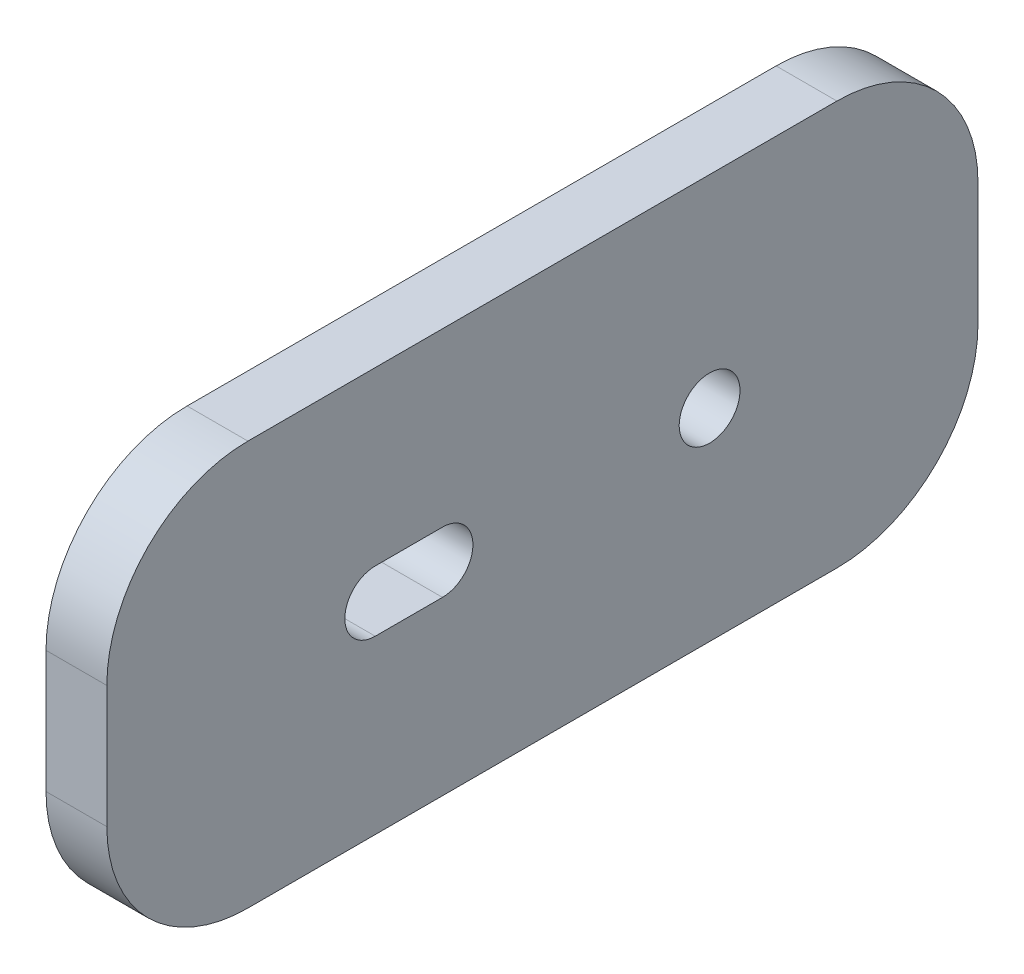
ISO-10303-21;
HEADER;
FILE_DESCRIPTION(('STEP AP214'),'2;1');
FILE_NAME('part.step','',(''),(''),'','','');
FILE_SCHEMA(('AUTOMOTIVE_DESIGN { 1 0 10303 214 1 1 1 1 }'));
ENDSEC;
DATA;
#1=APPLICATION_CONTEXT('core data for automotive mechanical design processes');
#2=APPLICATION_PROTOCOL_DEFINITION('international standard','automotive_design',2000,#1);
#3=PRODUCT_CONTEXT('',#1,'mechanical');
#4=PRODUCT('Part','Part','',(#3));
#5=PRODUCT_RELATED_PRODUCT_CATEGORY('part','',(#4));
#6=PRODUCT_DEFINITION_FORMATION('','',#4);
#7=PRODUCT_DEFINITION_CONTEXT('part definition',#1,'design');
#8=PRODUCT_DEFINITION('design','',#6,#7);
#9=PRODUCT_DEFINITION_SHAPE('','',#8);
#10=(LENGTH_UNIT() NAMED_UNIT(*) SI_UNIT(.MILLI.,.METRE.));
#11=(NAMED_UNIT(*) PLANE_ANGLE_UNIT() SI_UNIT($,.RADIAN.));
#12=(NAMED_UNIT(*) SI_UNIT($,.STERADIAN.) SOLID_ANGLE_UNIT());
#13=UNCERTAINTY_MEASURE_WITH_UNIT(LENGTH_MEASURE(1.E-05),#10,'distance_accuracy_value','');
#14=(GEOMETRIC_REPRESENTATION_CONTEXT(3) GLOBAL_UNCERTAINTY_ASSIGNED_CONTEXT((#13)) GLOBAL_UNIT_ASSIGNED_CONTEXT((#10,
#11,#12)) REPRESENTATION_CONTEXT('',''));
#15=CARTESIAN_POINT('',(0.,0.,0.));
#16=DIRECTION('',(0.,0.,1.));
#17=DIRECTION('',(1.,0.,0.));
#18=AXIS2_PLACEMENT_3D('',#15,#16,#17);
#19=CARTESIAN_POINT('',(0.,0.,0.));
#20=DIRECTION('',(1.,0.,0.));
#21=DIRECTION('',(0.,0.,-1.));
#22=AXIS2_PLACEMENT_3D('',#19,#20,#21);
#23=PLANE('',#22);
#24=CARTESIAN_POINT('',(0.,-6.38154088395931,-30.7417133345017));
#25=DIRECTION('',(-1.,0.,0.));
#26=DIRECTION('',(0.,0.,1.));
#27=AXIS2_PLACEMENT_3D('',#24,#25,#26);
#28=CIRCLE('',#27,14.7267027304759);
#29=CARTESIAN_POINT('',(0.,-21.1082436144352,-30.7417133345017));
#30=VERTEX_POINT('',#29);
#31=CARTESIAN_POINT('',(0.,-6.38154088395931,-45.4684160649777));
#32=VERTEX_POINT('',#31);
#33=EDGE_CURVE('E142',#30,#32,#28,.F.);
#34=ORIENTED_EDGE('',*,*,#33,.F.);
#35=DIRECTION('',(0.,0.,1.));
#36=VECTOR('',#35,1.);
#37=CARTESIAN_POINT('',(0.,-21.1082436144352,0.));
#38=LINE('',#37,#36);
#39=CARTESIAN_POINT('',(0.,-21.1082436144352,30.7417133345017));
#40=VERTEX_POINT('',#39);
#41=EDGE_CURVE('E128',#30,#40,#38,.T.);
#42=ORIENTED_EDGE('',*,*,#41,.T.);
#43=CARTESIAN_POINT('',(0.,-6.38154088395931,30.7417133345017));
#44=DIRECTION('',(1.,0.,0.));
#45=DIRECTION('',(0.,0.,-1.));
#46=AXIS2_PLACEMENT_3D('',#43,#44,#45);
#47=CIRCLE('',#46,14.7267027304759);
#48=CARTESIAN_POINT('',(0.,-6.38154088395931,45.4684160649777));
#49=VERTEX_POINT('',#48);
#50=EDGE_CURVE('E169',#49,#40,#47,.T.);
#51=ORIENTED_EDGE('',*,*,#50,.F.);
#52=DIRECTION('',(0.,1.,0.));
#53=VECTOR('',#52,1.);
#54=CARTESIAN_POINT('',(0.,0.,45.4684160649777));
#55=LINE('',#54,#53);
#56=CARTESIAN_POINT('',(0.,6.38154088395931,45.4684160649777));
#57=VERTEX_POINT('',#56);
#58=EDGE_CURVE('E132',#57,#49,#55,.F.);
#59=ORIENTED_EDGE('',*,*,#58,.F.);
#60=CARTESIAN_POINT('',(0.,6.38154088395931,30.7417133345017));
#61=DIRECTION('',(-1.,0.,0.));
#62=DIRECTION('',(0.,0.,1.));
#63=AXIS2_PLACEMENT_3D('',#60,#61,#62);
#64=CIRCLE('',#63,14.7267027304759);
#65=CARTESIAN_POINT('',(0.,21.1082436144352,30.7417133345017));
#66=VERTEX_POINT('',#65);
#67=EDGE_CURVE('E135',#66,#57,#64,.F.);
#68=ORIENTED_EDGE('',*,*,#67,.F.);
#69=DIRECTION('',(0.,0.,1.));
#70=VECTOR('',#69,1.);
#71=CARTESIAN_POINT('',(0.,21.1082436144352,0.));
#72=LINE('',#71,#70);
#73=CARTESIAN_POINT('',(0.,21.1082436144352,-30.7417133345017));
#74=VERTEX_POINT('',#73);
#75=EDGE_CURVE('E136',#74,#66,#72,.T.);
#76=ORIENTED_EDGE('',*,*,#75,.F.);
#77=CARTESIAN_POINT('',(0.,6.38154088395931,-30.7417133345017));
#78=DIRECTION('',(1.,0.,0.));
#79=DIRECTION('',(0.,0.,-1.));
#80=AXIS2_PLACEMENT_3D('',#77,#78,#79);
#81=CIRCLE('',#80,14.7267027304759);
#82=CARTESIAN_POINT('',(0.,6.38154088395931,-45.4684160649777));
#83=VERTEX_POINT('',#82);
#84=EDGE_CURVE('E175',#83,#74,#81,.T.);
#85=ORIENTED_EDGE('',*,*,#84,.F.);
#86=DIRECTION('',(0.,1.,0.));
#87=VECTOR('',#86,1.);
#88=CARTESIAN_POINT('',(0.,0.,-45.4684160649777));
#89=LINE('',#88,#87);
#90=EDGE_CURVE('E140',#83,#32,#89,.F.);
#91=ORIENTED_EDGE('',*,*,#90,.T.);
#92=EDGE_LOOP('',(#34,#42,#51,#59,#68,#76,#85,#91));
#93=FACE_BOUND('',#92,.T.);
#94=CARTESIAN_POINT('',(0.,0.,-17.45));
#95=DIRECTION('',(-1.,0.,0.));
#96=DIRECTION('',(0.,0.,1.));
#97=AXIS2_PLACEMENT_3D('',#94,#95,#96);
#98=CIRCLE('',#97,3.175);
#99=CARTESIAN_POINT('',(0.,0.,-14.275));
#100=VERTEX_POINT('',#99);
#101=EDGE_CURVE('E131',#100,#100,#98,.F.);
#102=ORIENTED_EDGE('',*,*,#101,.T.);
#103=EDGE_LOOP('',(#102));
#104=FACE_BOUND('',#103,.T.);
#105=CARTESIAN_POINT('',(0.,0.,10.4300102));
#106=DIRECTION('',(-1.,0.,0.));
#107=DIRECTION('',(0.,0.,1.));
#108=AXIS2_PLACEMENT_3D('',#105,#106,#107);
#109=CIRCLE('',#108,3.175);
#110=CARTESIAN_POINT('',(0.,-3.175,10.4300102));
#111=VERTEX_POINT('',#110);
#112=CARTESIAN_POINT('',(0.,3.175,10.4300102));
#113=VERTEX_POINT('',#112);
#114=EDGE_CURVE('E182',#111,#113,#109,.F.);
#115=ORIENTED_EDGE('',*,*,#114,.T.);
#116=DIRECTION('',(0.,0.,1.));
#117=VECTOR('',#116,1.);
#118=CARTESIAN_POINT('',(0.,3.175,13.9400051));
#119=LINE('',#118,#117);
#120=CARTESIAN_POINT('',(0.,3.175,17.45));
#121=VERTEX_POINT('',#120);
#122=EDGE_CURVE('E117',#113,#121,#119,.T.);
#123=ORIENTED_EDGE('',*,*,#122,.T.);
#124=CARTESIAN_POINT('',(0.,0.,17.45));
#125=DIRECTION('',(-1.,0.,0.));
#126=DIRECTION('',(0.,0.,1.));
#127=AXIS2_PLACEMENT_3D('',#124,#125,#126);
#128=CIRCLE('',#127,3.175);
#129=CARTESIAN_POINT('',(0.,-3.175,17.45));
#130=VERTEX_POINT('',#129);
#131=EDGE_CURVE('E20',#121,#130,#128,.F.);
#132=ORIENTED_EDGE('',*,*,#131,.T.);
#133=DIRECTION('',(0.,0.,1.));
#134=VECTOR('',#133,1.);
#135=CARTESIAN_POINT('',(0.,-3.175,13.9400051));
#136=LINE('',#135,#134);
#137=EDGE_CURVE('E107',#111,#130,#136,.T.);
#138=ORIENTED_EDGE('',*,*,#137,.F.);
#139=EDGE_LOOP('',(#115,#123,#132,#138));
#140=FACE_BOUND('',#139,.T.);
#141=ADVANCED_FACE('F17',(#93,#104,#140),#23,.F.);
#142=CARTESIAN_POINT('',(6.35,-3.175,13.9400051));
#143=DIRECTION('',(0.,1.,0.));
#144=DIRECTION('',(0.,0.,1.));
#145=AXIS2_PLACEMENT_3D('',#142,#143,#144);
#146=PLANE('',#145);
#147=DIRECTION('',(0.,0.,-1.));
#148=VECTOR('',#147,1.);
#149=CARTESIAN_POINT('',(6.35,-3.175,0.));
#150=LINE('',#149,#148);
#151=CARTESIAN_POINT('',(6.35,-3.175,10.4300102));
#152=VERTEX_POINT('',#151);
#153=CARTESIAN_POINT('',(6.35,-3.175,17.45));
#154=VERTEX_POINT('',#153);
#155=EDGE_CURVE('E168',#152,#154,#150,.F.);
#156=ORIENTED_EDGE('',*,*,#155,.F.);
#157=DIRECTION('',(-1.,0.,0.));
#158=VECTOR('',#157,1.);
#159=CARTESIAN_POINT('',(6.35,-3.175,10.4300102));
#160=LINE('',#159,#158);
#161=EDGE_CURVE('E112',#152,#111,#160,.T.);
#162=ORIENTED_EDGE('',*,*,#161,.T.);
#163=ORIENTED_EDGE('',*,*,#137,.T.);
#164=DIRECTION('',(-1.,0.,0.));
#165=VECTOR('',#164,1.);
#166=CARTESIAN_POINT('',(6.35,-3.175,17.45));
#167=LINE('',#166,#165);
#168=EDGE_CURVE('E109',#130,#154,#167,.F.);
#169=ORIENTED_EDGE('',*,*,#168,.T.);
#170=EDGE_LOOP('',(#156,#162,#163,#169));
#171=FACE_BOUND('',#170,.T.);
#172=ADVANCED_FACE('F108',(#171),#146,.T.);
#173=CARTESIAN_POINT('',(6.35,0.,17.45));
#174=DIRECTION('',(-1.,0.,0.));
#175=DIRECTION('',(0.,0.,1.));
#176=AXIS2_PLACEMENT_3D('',#173,#174,#175);
#177=CYLINDRICAL_SURFACE('',#176,3.175);
#178=DIRECTION('',(1.,0.,0.));
#179=VECTOR('',#178,1.);
#180=CARTESIAN_POINT('',(6.35,3.175,17.45));
#181=LINE('',#180,#179);
#182=CARTESIAN_POINT('',(6.35,3.175,17.45));
#183=VERTEX_POINT('',#182);
#184=EDGE_CURVE('E119',#121,#183,#181,.T.);
#185=ORIENTED_EDGE('',*,*,#184,.T.);
#186=CARTESIAN_POINT('',(6.35,0.,17.45));
#187=DIRECTION('',(-1.,0.,0.));
#188=DIRECTION('',(0.,0.,1.));
#189=AXIS2_PLACEMENT_3D('',#186,#187,#188);
#190=CIRCLE('',#189,3.175);
#191=EDGE_CURVE('E122',#154,#183,#190,.T.);
#192=ORIENTED_EDGE('',*,*,#191,.F.);
#193=ORIENTED_EDGE('',*,*,#168,.F.);
#194=ORIENTED_EDGE('',*,*,#131,.F.);
#195=EDGE_LOOP('',(#185,#192,#193,#194));
#196=FACE_BOUND('',#195,.T.);
#197=ADVANCED_FACE('F120',(#196),#177,.F.);
#198=CARTESIAN_POINT('',(6.35,3.175,13.9400051));
#199=DIRECTION('',(0.,1.,0.));
#200=DIRECTION('',(0.,0.,1.));
#201=AXIS2_PLACEMENT_3D('',#198,#199,#200);
#202=PLANE('',#201);
#203=DIRECTION('',(-1.,0.,0.));
#204=VECTOR('',#203,1.);
#205=CARTESIAN_POINT('',(6.35,3.175,10.4300102));
#206=LINE('',#205,#204);
#207=CARTESIAN_POINT('',(6.35,3.175,10.4300102));
#208=VERTEX_POINT('',#207);
#209=EDGE_CURVE('E144',#113,#208,#206,.F.);
#210=ORIENTED_EDGE('',*,*,#209,.T.);
#211=DIRECTION('',(0.,0.,-1.));
#212=VECTOR('',#211,1.);
#213=CARTESIAN_POINT('',(6.35,3.175,0.));
#214=LINE('',#213,#212);
#215=EDGE_CURVE('E166',#183,#208,#214,.T.);
#216=ORIENTED_EDGE('',*,*,#215,.F.);
#217=ORIENTED_EDGE('',*,*,#184,.F.);
#218=ORIENTED_EDGE('',*,*,#122,.F.);
#219=EDGE_LOOP('',(#210,#216,#217,#218));
#220=FACE_BOUND('',#219,.T.);
#221=ADVANCED_FACE('F335',(#220),#202,.F.);
#222=CARTESIAN_POINT('',(6.35,0.,10.4300102));
#223=DIRECTION('',(-1.,0.,0.));
#224=DIRECTION('',(0.,0.,1.));
#225=AXIS2_PLACEMENT_3D('',#222,#223,#224);
#226=CYLINDRICAL_SURFACE('',#225,3.175);
#227=ORIENTED_EDGE('',*,*,#161,.F.);
#228=CARTESIAN_POINT('',(6.35,0.,10.4300102));
#229=DIRECTION('',(-1.,0.,0.));
#230=DIRECTION('',(0.,0.,1.));
#231=AXIS2_PLACEMENT_3D('',#228,#229,#230);
#232=CIRCLE('',#231,3.175);
#233=EDGE_CURVE('E161',#208,#152,#232,.T.);
#234=ORIENTED_EDGE('',*,*,#233,.F.);
#235=ORIENTED_EDGE('',*,*,#209,.F.);
#236=ORIENTED_EDGE('',*,*,#114,.F.);
#237=EDGE_LOOP('',(#227,#234,#235,#236));
#238=FACE_BOUND('',#237,.T.);
#239=ADVANCED_FACE('F326',(#238),#226,.F.);
#240=CARTESIAN_POINT('',(6.35,0.,-17.45));
#241=DIRECTION('',(-1.,0.,0.));
#242=DIRECTION('',(0.,0.,1.));
#243=AXIS2_PLACEMENT_3D('',#240,#241,#242);
#244=CYLINDRICAL_SURFACE('',#243,3.175);
#245=ORIENTED_EDGE('',*,*,#101,.F.);
#246=EDGE_LOOP('',(#245));
#247=FACE_BOUND('',#246,.T.);
#248=CARTESIAN_POINT('',(6.35,0.,-17.45));
#249=DIRECTION('',(-1.,0.,0.));
#250=DIRECTION('',(0.,0.,1.));
#251=AXIS2_PLACEMENT_3D('',#248,#249,#250);
#252=CIRCLE('',#251,3.175);
#253=CARTESIAN_POINT('',(6.35,0.,-14.275));
#254=VERTEX_POINT('',#253);
#255=EDGE_CURVE('E158',#254,#254,#252,.T.);
#256=ORIENTED_EDGE('',*,*,#255,.F.);
#257=EDGE_LOOP('',(#256));
#258=FACE_BOUND('',#257,.T.);
#259=ADVANCED_FACE('F318',(#247,#258),#244,.F.);
#260=CARTESIAN_POINT('',(6.35,-21.1082436144352,0.));
#261=DIRECTION('',(0.,1.,0.));
#262=DIRECTION('',(0.,0.,1.));
#263=AXIS2_PLACEMENT_3D('',#260,#261,#262);
#264=PLANE('',#263);
#265=DIRECTION('',(-1.,0.,0.));
#266=VECTOR('',#265,1.);
#267=CARTESIAN_POINT('',(6.35,-21.1082436144352,-30.7417133345017));
#268=LINE('',#267,#266);
#269=CARTESIAN_POINT('',(6.35,-21.1082436144352,-30.7417133345017));
#270=VERTEX_POINT('',#269);
#271=EDGE_CURVE('E130',#270,#30,#268,.T.);
#272=ORIENTED_EDGE('',*,*,#271,.F.);
#273=DIRECTION('',(0.,0.,-1.));
#274=VECTOR('',#273,1.);
#275=CARTESIAN_POINT('',(6.35,-21.1082436144352,0.));
#276=LINE('',#275,#274);
#277=CARTESIAN_POINT('',(6.35,-21.1082436144352,30.7417133345017));
#278=VERTEX_POINT('',#277);
#279=EDGE_CURVE('E157',#278,#270,#276,.T.);
#280=ORIENTED_EDGE('',*,*,#279,.F.);
#281=DIRECTION('',(1.,0.,0.));
#282=VECTOR('',#281,1.);
#283=CARTESIAN_POINT('',(6.35,-21.1082436144352,30.7417133345017));
#284=LINE('',#283,#282);
#285=EDGE_CURVE('E172',#40,#278,#284,.T.);
#286=ORIENTED_EDGE('',*,*,#285,.F.);
#287=ORIENTED_EDGE('',*,*,#41,.F.);
#288=EDGE_LOOP('',(#272,#280,#286,#287));
#289=FACE_BOUND('',#288,.T.);
#290=ADVANCED_FACE('F229',(#289),#264,.F.);
#291=CARTESIAN_POINT('',(6.35,-6.38154088395931,-30.7417133345017));
#292=DIRECTION('',(-1.,0.,0.));
#293=DIRECTION('',(0.,0.,1.));
#294=AXIS2_PLACEMENT_3D('',#291,#292,#293);
#295=CYLINDRICAL_SURFACE('',#294,14.7267027304759);
#296=ORIENTED_EDGE('',*,*,#33,.T.);
#297=DIRECTION('',(1.,0.,0.));
#298=VECTOR('',#297,1.);
#299=CARTESIAN_POINT('',(6.35,-6.38154088395931,-45.4684160649777));
#300=LINE('',#299,#298);
#301=CARTESIAN_POINT('',(6.35,-6.38154088395931,-45.4684160649777));
#302=VERTEX_POINT('',#301);
#303=EDGE_CURVE('E141',#32,#302,#300,.T.);
#304=ORIENTED_EDGE('',*,*,#303,.T.);
#305=CARTESIAN_POINT('',(6.35,-6.38154088395931,-30.7417133345017));
#306=DIRECTION('',(-1.,0.,0.));
#307=DIRECTION('',(0.,0.,1.));
#308=AXIS2_PLACEMENT_3D('',#305,#306,#307);
#309=CIRCLE('',#308,14.7267027304759);
#310=EDGE_CURVE('E154',#270,#302,#309,.F.);
#311=ORIENTED_EDGE('',*,*,#310,.F.);
#312=ORIENTED_EDGE('',*,*,#271,.T.);
#313=EDGE_LOOP('',(#296,#304,#311,#312));
#314=FACE_BOUND('',#313,.T.);
#315=ADVANCED_FACE('F233',(#314),#295,.T.);
#316=CARTESIAN_POINT('',(6.35,0.,-45.4684160649777));
#317=DIRECTION('',(0.,0.,1.));
#318=DIRECTION('',(1.,0.,0.));
#319=AXIS2_PLACEMENT_3D('',#316,#317,#318);
#320=PLANE('',#319);
#321=ORIENTED_EDGE('',*,*,#303,.F.);
#322=ORIENTED_EDGE('',*,*,#90,.F.);
#323=DIRECTION('',(1.,0.,0.));
#324=VECTOR('',#323,1.);
#325=CARTESIAN_POINT('',(6.35,6.38154088395931,-45.4684160649776));
#326=LINE('',#325,#324);
#327=CARTESIAN_POINT('',(6.35,6.38154088395931,-45.4684160649777));
#328=VERTEX_POINT('',#327);
#329=EDGE_CURVE('E177',#328,#83,#326,.F.);
#330=ORIENTED_EDGE('',*,*,#329,.F.);
#331=DIRECTION('',(0.,1.,0.));
#332=VECTOR('',#331,1.);
#333=CARTESIAN_POINT('',(6.35,0.,-45.4684160649777));
#334=LINE('',#333,#332);
#335=EDGE_CURVE('E153',#302,#328,#334,.T.);
#336=ORIENTED_EDGE('',*,*,#335,.F.);
#337=EDGE_LOOP('',(#321,#322,#330,#336));
#338=FACE_BOUND('',#337,.T.);
#339=ADVANCED_FACE('F236',(#338),#320,.F.);
#340=CARTESIAN_POINT('',(6.35,6.38154088395931,-30.7417133345017));
#341=DIRECTION('',(1.,0.,0.));
#342=DIRECTION('',(0.,0.,-1.));
#343=AXIS2_PLACEMENT_3D('',#340,#341,#342);
#344=CYLINDRICAL_SURFACE('',#343,14.7267027304759);
#345=ORIENTED_EDGE('',*,*,#84,.T.);
#346=DIRECTION('',(1.,0.,0.));
#347=VECTOR('',#346,1.);
#348=CARTESIAN_POINT('',(6.35,21.1082436144352,-30.7417133345017));
#349=LINE('',#348,#347);
#350=CARTESIAN_POINT('',(6.35,21.1082436144352,-30.7417133345017));
#351=VERTEX_POINT('',#350);
#352=EDGE_CURVE('E139',#351,#74,#349,.F.);
#353=ORIENTED_EDGE('',*,*,#352,.F.);
#354=CARTESIAN_POINT('',(6.35,6.38154088395931,-30.7417133345017));
#355=DIRECTION('',(1.,0.,0.));
#356=DIRECTION('',(0.,0.,-1.));
#357=AXIS2_PLACEMENT_3D('',#354,#355,#356);
#358=CIRCLE('',#357,14.7267027304759);
#359=EDGE_CURVE('E150',#328,#351,#358,.T.);
#360=ORIENTED_EDGE('',*,*,#359,.F.);
#361=ORIENTED_EDGE('',*,*,#329,.T.);
#362=EDGE_LOOP('',(#345,#353,#360,#361));
#363=FACE_BOUND('',#362,.T.);
#364=ADVANCED_FACE('F239',(#363),#344,.T.);
#365=CARTESIAN_POINT('',(6.35,21.1082436144352,0.));
#366=DIRECTION('',(0.,1.,0.));
#367=DIRECTION('',(0.,0.,1.));
#368=AXIS2_PLACEMENT_3D('',#365,#366,#367);
#369=PLANE('',#368);
#370=ORIENTED_EDGE('',*,*,#75,.T.);
#371=DIRECTION('',(-1.,0.,0.));
#372=VECTOR('',#371,1.);
#373=CARTESIAN_POINT('',(6.35,21.1082436144352,30.7417133345017));
#374=LINE('',#373,#372);
#375=CARTESIAN_POINT('',(6.35,21.1082436144352,30.7417133345017));
#376=VERTEX_POINT('',#375);
#377=EDGE_CURVE('E138',#376,#66,#374,.T.);
#378=ORIENTED_EDGE('',*,*,#377,.F.);
#379=DIRECTION('',(0.,0.,-1.));
#380=VECTOR('',#379,1.);
#381=CARTESIAN_POINT('',(6.35,21.1082436144352,0.));
#382=LINE('',#381,#380);
#383=EDGE_CURVE('E149',#351,#376,#382,.F.);
#384=ORIENTED_EDGE('',*,*,#383,.F.);
#385=ORIENTED_EDGE('',*,*,#352,.T.);
#386=EDGE_LOOP('',(#370,#378,#384,#385));
#387=FACE_BOUND('',#386,.T.);
#388=ADVANCED_FACE('F242',(#387),#369,.T.);
#389=CARTESIAN_POINT('',(6.35,6.38154088395931,30.7417133345017));
#390=DIRECTION('',(-1.,0.,0.));
#391=DIRECTION('',(0.,0.,1.));
#392=AXIS2_PLACEMENT_3D('',#389,#390,#391);
#393=CYLINDRICAL_SURFACE('',#392,14.7267027304759);
#394=ORIENTED_EDGE('',*,*,#67,.T.);
#395=DIRECTION('',(1.,0.,0.));
#396=VECTOR('',#395,1.);
#397=CARTESIAN_POINT('',(6.35,6.38154088395931,45.4684160649777));
#398=LINE('',#397,#396);
#399=CARTESIAN_POINT('',(6.35,6.38154088395931,45.4684160649777));
#400=VERTEX_POINT('',#399);
#401=EDGE_CURVE('E134',#400,#57,#398,.F.);
#402=ORIENTED_EDGE('',*,*,#401,.F.);
#403=CARTESIAN_POINT('',(6.35,6.38154088395931,30.7417133345017));
#404=DIRECTION('',(-1.,0.,0.));
#405=DIRECTION('',(0.,0.,1.));
#406=AXIS2_PLACEMENT_3D('',#403,#404,#405);
#407=CIRCLE('',#406,14.7267027304759);
#408=EDGE_CURVE('E146',#376,#400,#407,.F.);
#409=ORIENTED_EDGE('',*,*,#408,.F.);
#410=ORIENTED_EDGE('',*,*,#377,.T.);
#411=EDGE_LOOP('',(#394,#402,#409,#410));
#412=FACE_BOUND('',#411,.T.);
#413=ADVANCED_FACE('F218',(#412),#393,.T.);
#414=CARTESIAN_POINT('',(6.35,0.,45.4684160649777));
#415=DIRECTION('',(0.,0.,1.));
#416=DIRECTION('',(1.,0.,0.));
#417=AXIS2_PLACEMENT_3D('',#414,#415,#416);
#418=PLANE('',#417);
#419=DIRECTION('',(0.,1.,0.));
#420=VECTOR('',#419,1.);
#421=CARTESIAN_POINT('',(6.35,0.,45.4684160649777));
#422=LINE('',#421,#420);
#423=CARTESIAN_POINT('',(6.35,-6.38154088395931,45.4684160649777));
#424=VERTEX_POINT('',#423);
#425=EDGE_CURVE('E26',#400,#424,#422,.F.);
#426=ORIENTED_EDGE('',*,*,#425,.F.);
#427=ORIENTED_EDGE('',*,*,#401,.T.);
#428=ORIENTED_EDGE('',*,*,#58,.T.);
#429=DIRECTION('',(1.,0.,0.));
#430=VECTOR('',#429,1.);
#431=CARTESIAN_POINT('',(6.35,-6.38154088395931,45.4684160649776));
#432=LINE('',#431,#430);
#433=EDGE_CURVE('E35',#424,#49,#432,.F.);
#434=ORIENTED_EDGE('',*,*,#433,.F.);
#435=EDGE_LOOP('',(#426,#427,#428,#434));
#436=FACE_BOUND('',#435,.T.);
#437=ADVANCED_FACE('F215',(#436),#418,.T.);
#438=CARTESIAN_POINT('',(6.35,-6.38154088395931,30.7417133345017));
#439=DIRECTION('',(1.,0.,0.));
#440=DIRECTION('',(0.,0.,-1.));
#441=AXIS2_PLACEMENT_3D('',#438,#439,#440);
#442=CYLINDRICAL_SURFACE('',#441,14.7267027304759);
#443=ORIENTED_EDGE('',*,*,#50,.T.);
#444=ORIENTED_EDGE('',*,*,#285,.T.);
#445=CARTESIAN_POINT('',(6.35,-6.38154088395931,30.7417133345017));
#446=DIRECTION('',(1.,0.,0.));
#447=DIRECTION('',(0.,0.,-1.));
#448=AXIS2_PLACEMENT_3D('',#445,#446,#447);
#449=CIRCLE('',#448,14.7267027304759);
#450=EDGE_CURVE('E11',#424,#278,#449,.T.);
#451=ORIENTED_EDGE('',*,*,#450,.F.);
#452=ORIENTED_EDGE('',*,*,#433,.T.);
#453=EDGE_LOOP('',(#443,#444,#451,#452));
#454=FACE_BOUND('',#453,.T.);
#455=ADVANCED_FACE('F227',(#454),#442,.T.);
#456=CARTESIAN_POINT('',(6.35,0.,0.));
#457=DIRECTION('',(1.,0.,0.));
#458=DIRECTION('',(0.,0.,-1.));
#459=AXIS2_PLACEMENT_3D('',#456,#457,#458);
#460=PLANE('',#459);
#461=ORIENTED_EDGE('',*,*,#425,.T.);
#462=ORIENTED_EDGE('',*,*,#450,.T.);
#463=ORIENTED_EDGE('',*,*,#279,.T.);
#464=ORIENTED_EDGE('',*,*,#310,.T.);
#465=ORIENTED_EDGE('',*,*,#335,.T.);
#466=ORIENTED_EDGE('',*,*,#359,.T.);
#467=ORIENTED_EDGE('',*,*,#383,.T.);
#468=ORIENTED_EDGE('',*,*,#408,.T.);
#469=EDGE_LOOP('',(#461,#462,#463,#464,#465,#466,#467,#468));
#470=FACE_BOUND('',#469,.T.);
#471=ORIENTED_EDGE('',*,*,#255,.T.);
#472=EDGE_LOOP('',(#471));
#473=FACE_BOUND('',#472,.T.);
#474=ORIENTED_EDGE('',*,*,#215,.T.);
#475=ORIENTED_EDGE('',*,*,#233,.T.);
#476=ORIENTED_EDGE('',*,*,#155,.T.);
#477=ORIENTED_EDGE('',*,*,#191,.T.);
#478=EDGE_LOOP('',(#474,#475,#476,#477));
#479=FACE_BOUND('',#478,.T.);
#480=ADVANCED_FACE('F212',(#470,#473,#479),#460,.T.);
#481=CLOSED_SHELL('',(#141,#172,#197,#221,#239,#259,#290,#315,#339,#364,#388,#413,#437,#455,#480));
#482=MANIFOLD_SOLID_BREP('B1',#481);
#483=ADVANCED_BREP_SHAPE_REPRESENTATION('',(#18,#482),#14);
#484=SHAPE_DEFINITION_REPRESENTATION(#9,#483);
ENDSEC;
END-ISO-10303-21;
